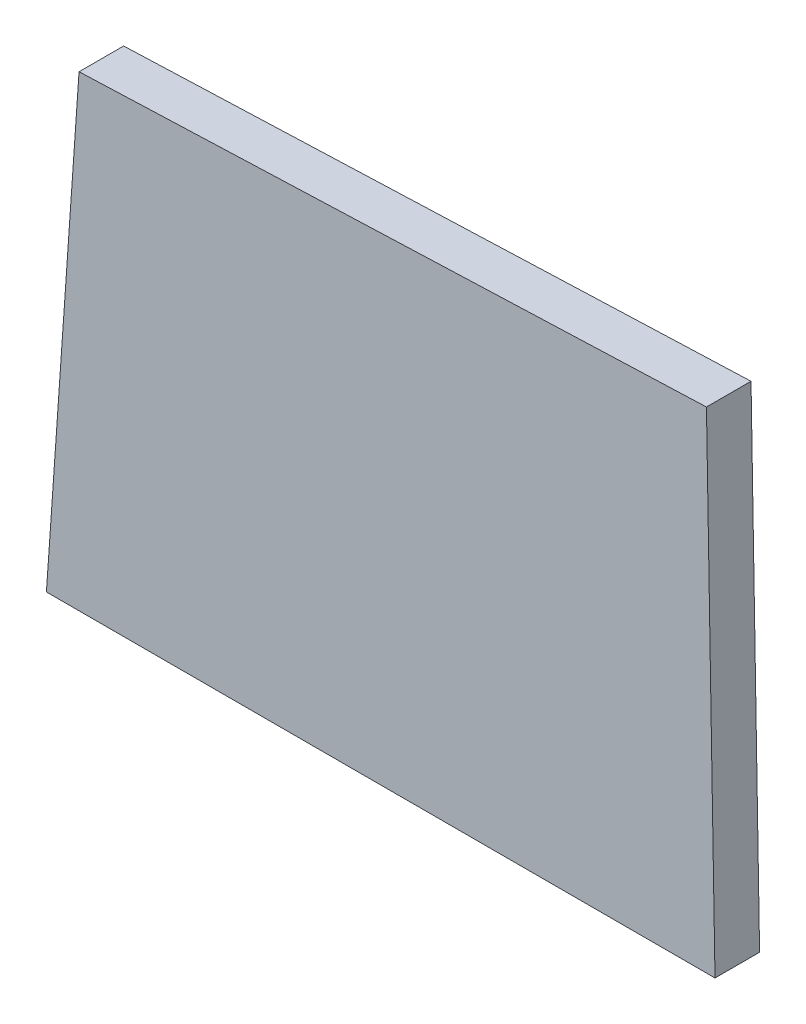
ISO-10303-21;
HEADER;
FILE_DESCRIPTION(('STEP AP214'),'2;1');
FILE_NAME('part.step','',(''),(''),'','','');
FILE_SCHEMA(('AUTOMOTIVE_DESIGN { 1 0 10303 214 1 1 1 1 }'));
ENDSEC;
DATA;
#1=APPLICATION_CONTEXT('core data for automotive mechanical design processes');
#2=APPLICATION_PROTOCOL_DEFINITION('international standard','automotive_design',2000,#1);
#3=PRODUCT_CONTEXT('',#1,'mechanical');
#4=PRODUCT('Part','Part','',(#3));
#5=PRODUCT_RELATED_PRODUCT_CATEGORY('part','',(#4));
#6=PRODUCT_DEFINITION_FORMATION('','',#4);
#7=PRODUCT_DEFINITION_CONTEXT('part definition',#1,'design');
#8=PRODUCT_DEFINITION('design','',#6,#7);
#9=PRODUCT_DEFINITION_SHAPE('','',#8);
#10=(LENGTH_UNIT() NAMED_UNIT(*) SI_UNIT(.MILLI.,.METRE.));
#11=(NAMED_UNIT(*) PLANE_ANGLE_UNIT() SI_UNIT($,.RADIAN.));
#12=(NAMED_UNIT(*) SI_UNIT($,.STERADIAN.) SOLID_ANGLE_UNIT());
#13=UNCERTAINTY_MEASURE_WITH_UNIT(LENGTH_MEASURE(1.E-05),#10,'distance_accuracy_value','');
#14=(GEOMETRIC_REPRESENTATION_CONTEXT(3) GLOBAL_UNCERTAINTY_ASSIGNED_CONTEXT((#13)) GLOBAL_UNIT_ASSIGNED_CONTEXT((#10,
#11,#12)) REPRESENTATION_CONTEXT('',''));
#15=CARTESIAN_POINT('',(0.,0.,0.));
#16=DIRECTION('',(0.,0.,1.));
#17=DIRECTION('',(1.,0.,0.));
#18=AXIS2_PLACEMENT_3D('',#15,#16,#17);
#19=CARTESIAN_POINT('',(30.,0.,2.));
#20=DIRECTION('',(0.,1.,0.));
#21=DIRECTION('',(-1.,0.,0.));
#22=AXIS2_PLACEMENT_3D('',#19,#20,#21);
#23=PLANE('',#22);
#24=DIRECTION('',(1.,0.,0.));
#25=VECTOR('',#24,1.);
#26=CARTESIAN_POINT('',(30.,0.,0.));
#27=LINE('',#26,#25);
#28=CARTESIAN_POINT('',(0.,0.,0.));
#29=VERTEX_POINT('',#28);
#30=CARTESIAN_POINT('',(30.,0.,0.));
#31=VERTEX_POINT('',#30);
#32=EDGE_CURVE('E107',#29,#31,#27,.T.);
#33=ORIENTED_EDGE('',*,*,#32,.T.);
#34=DIRECTION('',(0.,0.,-1.));
#35=VECTOR('',#34,1.);
#36=CARTESIAN_POINT('',(30.,0.,2.));
#37=LINE('',#36,#35);
#38=CARTESIAN_POINT('',(30.,0.,2.));
#39=VERTEX_POINT('',#38);
#40=EDGE_CURVE('E11',#39,#31,#37,.T.);
#41=ORIENTED_EDGE('',*,*,#40,.F.);
#42=DIRECTION('',(1.,0.,0.));
#43=VECTOR('',#42,1.);
#44=CARTESIAN_POINT('',(30.,0.,2.));
#45=LINE('',#44,#43);
#46=CARTESIAN_POINT('',(0.,0.,2.));
#47=VERTEX_POINT('',#46);
#48=EDGE_CURVE('E91',#47,#39,#45,.T.);
#49=ORIENTED_EDGE('',*,*,#48,.F.);
#50=DIRECTION('',(0.,0.,-1.));
#51=VECTOR('',#50,1.);
#52=CARTESIAN_POINT('',(0.,0.,2.));
#53=LINE('',#52,#51);
#54=EDGE_CURVE('E103',#47,#29,#53,.T.);
#55=ORIENTED_EDGE('',*,*,#54,.T.);
#56=EDGE_LOOP('',(#33,#41,#49,#55));
#57=FACE_BOUND('',#56,.T.);
#58=ADVANCED_FACE('F39',(#57),#23,.F.);
#59=CARTESIAN_POINT('',(29.6160470583797,21.9966492934406,2.));
#60=DIRECTION('',(-0.999847695156391,-0.0174524064372871,0.));
#61=DIRECTION('',(0.0174524064372871,-0.999847695156391,0.));
#62=AXIS2_PLACEMENT_3D('',#59,#60,#61);
#63=PLANE('',#62);
#64=DIRECTION('',(-0.0174524064372871,0.999847695156391,0.));
#65=VECTOR('',#64,1.);
#66=CARTESIAN_POINT('',(29.6160470583797,21.9966492934406,0.));
#67=LINE('',#66,#65);
#68=CARTESIAN_POINT('',(29.6160470583797,21.9966492934406,0.));
#69=VERTEX_POINT('',#68);
#70=EDGE_CURVE('E96',#31,#69,#67,.T.);
#71=ORIENTED_EDGE('',*,*,#70,.T.);
#72=DIRECTION('',(0.,0.,-1.));
#73=VECTOR('',#72,1.);
#74=CARTESIAN_POINT('',(29.6160470583797,21.9966492934406,2.));
#75=LINE('',#74,#73);
#76=CARTESIAN_POINT('',(29.6160470583797,21.9966492934406,2.));
#77=VERTEX_POINT('',#76);
#78=EDGE_CURVE('E48',#77,#69,#75,.T.);
#79=ORIENTED_EDGE('',*,*,#78,.F.);
#80=DIRECTION('',(-0.0174524064372871,0.999847695156391,0.));
#81=VECTOR('',#80,1.);
#82=CARTESIAN_POINT('',(29.6160470583797,21.9966492934406,2.));
#83=LINE('',#82,#81);
#84=EDGE_CURVE('E86',#39,#77,#83,.T.);
#85=ORIENTED_EDGE('',*,*,#84,.F.);
#86=ORIENTED_EDGE('',*,*,#40,.T.);
#87=EDGE_LOOP('',(#71,#79,#85,#86));
#88=FACE_BOUND('',#87,.T.);
#89=ADVANCED_FACE('F95',(#88),#63,.F.);
#90=CARTESIAN_POINT('',(1.4648859486267,20.9488450554563,2.));
#91=DIRECTION('',(0.0371948846341671,-0.999308030867886,0.));
#92=DIRECTION('',(0.999308030867886,0.0371948846341671,0.));
#93=AXIS2_PLACEMENT_3D('',#90,#91,#92);
#94=PLANE('',#93);
#95=DIRECTION('',(-0.999308030867886,-0.0371948846341671,0.));
#96=VECTOR('',#95,1.);
#97=CARTESIAN_POINT('',(1.4648859486267,20.9488450554563,0.));
#98=LINE('',#97,#96);
#99=CARTESIAN_POINT('',(1.4648859486267,20.9488450554563,0.));
#100=VERTEX_POINT('',#99);
#101=EDGE_CURVE('E73',#69,#100,#98,.T.);
#102=ORIENTED_EDGE('',*,*,#101,.T.);
#103=DIRECTION('',(0.,0.,-1.));
#104=VECTOR('',#103,1.);
#105=CARTESIAN_POINT('',(1.4648859486267,20.9488450554563,2.));
#106=LINE('',#105,#104);
#107=CARTESIAN_POINT('',(1.4648859486267,20.9488450554563,2.));
#108=VERTEX_POINT('',#107);
#109=EDGE_CURVE('E98',#108,#100,#106,.T.);
#110=ORIENTED_EDGE('',*,*,#109,.F.);
#111=DIRECTION('',(-0.999308030867886,-0.0371948846341671,0.));
#112=VECTOR('',#111,1.);
#113=CARTESIAN_POINT('',(1.4648859486267,20.9488450554563,2.));
#114=LINE('',#113,#112);
#115=EDGE_CURVE('E89',#77,#108,#114,.T.);
#116=ORIENTED_EDGE('',*,*,#115,.F.);
#117=ORIENTED_EDGE('',*,*,#78,.T.);
#118=EDGE_LOOP('',(#102,#110,#116,#117));
#119=FACE_BOUND('',#118,.T.);
#120=ADVANCED_FACE('F99',(#119),#94,.F.);
#121=CARTESIAN_POINT('',(0.,0.,2.));
#122=DIRECTION('',(0.997564050259824,-0.0697564737441288,0.));
#123=DIRECTION('',(0.0697564737441288,0.997564050259824,0.));
#124=AXIS2_PLACEMENT_3D('',#121,#122,#123);
#125=PLANE('',#124);
#126=DIRECTION('',(-0.0697564737441288,-0.997564050259824,0.));
#127=VECTOR('',#126,1.);
#128=CARTESIAN_POINT('',(0.,0.,0.));
#129=LINE('',#128,#127);
#130=EDGE_CURVE('E79',#100,#29,#129,.T.);
#131=ORIENTED_EDGE('',*,*,#130,.T.);
#132=ORIENTED_EDGE('',*,*,#54,.F.);
#133=DIRECTION('',(-0.0697564737441288,-0.997564050259824,0.));
#134=VECTOR('',#133,1.);
#135=CARTESIAN_POINT('',(0.,0.,2.));
#136=LINE('',#135,#134);
#137=EDGE_CURVE('E56',#108,#47,#136,.T.);
#138=ORIENTED_EDGE('',*,*,#137,.F.);
#139=ORIENTED_EDGE('',*,*,#109,.T.);
#140=EDGE_LOOP('',(#131,#132,#138,#139));
#141=FACE_BOUND('',#140,.T.);
#142=ADVANCED_FACE('F120',(#141),#125,.F.);
#143=CARTESIAN_POINT('',(0.,0.,2.));
#144=DIRECTION('',(0.,0.,1.));
#145=DIRECTION('',(1.,0.,0.));
#146=AXIS2_PLACEMENT_3D('',#143,#144,#145);
#147=PLANE('',#146);
#148=ORIENTED_EDGE('',*,*,#48,.T.);
#149=ORIENTED_EDGE('',*,*,#84,.T.);
#150=ORIENTED_EDGE('',*,*,#115,.T.);
#151=ORIENTED_EDGE('',*,*,#137,.T.);
#152=EDGE_LOOP('',(#148,#149,#150,#151));
#153=FACE_BOUND('',#152,.T.);
#154=ADVANCED_FACE('F87',(#153),#147,.T.);
#155=CARTESIAN_POINT('',(0.,0.,0.));
#156=DIRECTION('',(0.,0.,1.));
#157=DIRECTION('',(1.,0.,0.));
#158=AXIS2_PLACEMENT_3D('',#155,#156,#157);
#159=PLANE('',#158);
#160=ORIENTED_EDGE('',*,*,#32,.F.);
#161=ORIENTED_EDGE('',*,*,#130,.F.);
#162=ORIENTED_EDGE('',*,*,#101,.F.);
#163=ORIENTED_EDGE('',*,*,#70,.F.);
#164=EDGE_LOOP('',(#160,#161,#162,#163));
#165=FACE_BOUND('',#164,.T.);
#166=ADVANCED_FACE('F123',(#165),#159,.F.);
#167=CLOSED_SHELL('',(#58,#89,#120,#142,#154,#166));
#168=MANIFOLD_SOLID_BREP('B2',#167);
#169=ADVANCED_BREP_SHAPE_REPRESENTATION('',(#18,#168),#14);
#170=SHAPE_DEFINITION_REPRESENTATION(#9,#169);
ENDSEC;
END-ISO-10303-21;
